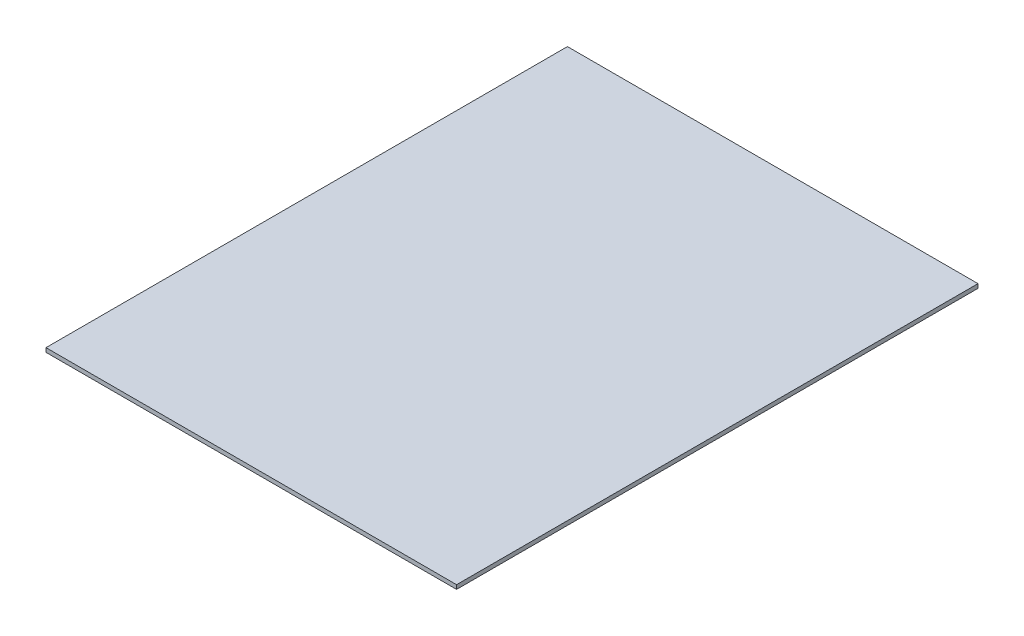
ISO-10303-21;
HEADER;
FILE_DESCRIPTION(('STEP AP214'),'2;1');
FILE_NAME('part.step','',(''),(''),'','','');
FILE_SCHEMA(('AUTOMOTIVE_DESIGN { 1 0 10303 214 1 1 1 1 }'));
ENDSEC;
DATA;
#1=APPLICATION_CONTEXT('core data for automotive mechanical design processes');
#2=APPLICATION_PROTOCOL_DEFINITION('international standard','automotive_design',2000,#1);
#3=PRODUCT_CONTEXT('',#1,'mechanical');
#4=PRODUCT('Part','Part','',(#3));
#5=PRODUCT_RELATED_PRODUCT_CATEGORY('part','',(#4));
#6=PRODUCT_DEFINITION_FORMATION('','',#4);
#7=PRODUCT_DEFINITION_CONTEXT('part definition',#1,'design');
#8=PRODUCT_DEFINITION('design','',#6,#7);
#9=PRODUCT_DEFINITION_SHAPE('','',#8);
#10=(LENGTH_UNIT() NAMED_UNIT(*) SI_UNIT(.MILLI.,.METRE.));
#11=(NAMED_UNIT(*) PLANE_ANGLE_UNIT() SI_UNIT($,.RADIAN.));
#12=(NAMED_UNIT(*) SI_UNIT($,.STERADIAN.) SOLID_ANGLE_UNIT());
#13=UNCERTAINTY_MEASURE_WITH_UNIT(LENGTH_MEASURE(1.E-05),#10,'distance_accuracy_value','');
#14=(GEOMETRIC_REPRESENTATION_CONTEXT(3) GLOBAL_UNCERTAINTY_ASSIGNED_CONTEXT((#13)) GLOBAL_UNIT_ASSIGNED_CONTEXT((#10,
#11,#12)) REPRESENTATION_CONTEXT('',''));
#15=CARTESIAN_POINT('',(0.,0.,0.));
#16=DIRECTION('',(0.,0.,1.));
#17=DIRECTION('',(1.,0.,0.));
#18=AXIS2_PLACEMENT_3D('',#15,#16,#17);
#19=CARTESIAN_POINT('',(-150.,3.,190.5));
#20=DIRECTION('',(1.,0.,0.));
#21=DIRECTION('',(0.,0.,-1.));
#22=AXIS2_PLACEMENT_3D('',#19,#20,#21);
#23=PLANE('',#22);
#24=DIRECTION('',(0.,0.,1.));
#25=VECTOR('',#24,1.);
#26=CARTESIAN_POINT('',(-150.,0.,190.5));
#27=LINE('',#26,#25);
#28=CARTESIAN_POINT('',(-150.,0.,-190.5));
#29=VERTEX_POINT('',#28);
#30=CARTESIAN_POINT('',(-150.,0.,190.5));
#31=VERTEX_POINT('',#30);
#32=EDGE_CURVE('E95',#29,#31,#27,.T.);
#33=ORIENTED_EDGE('',*,*,#32,.T.);
#34=DIRECTION('',(0.,-1.,0.));
#35=VECTOR('',#34,1.);
#36=CARTESIAN_POINT('',(-150.,3.,190.5));
#37=LINE('',#36,#35);
#38=CARTESIAN_POINT('',(-150.,3.,190.5));
#39=VERTEX_POINT('',#38);
#40=EDGE_CURVE('E11',#39,#31,#37,.T.);
#41=ORIENTED_EDGE('',*,*,#40,.F.);
#42=DIRECTION('',(0.,0.,1.));
#43=VECTOR('',#42,1.);
#44=CARTESIAN_POINT('',(-150.,3.,190.5));
#45=LINE('',#44,#43);
#46=CARTESIAN_POINT('',(-150.,3.,-190.5));
#47=VERTEX_POINT('',#46);
#48=EDGE_CURVE('E83',#47,#39,#45,.T.);
#49=ORIENTED_EDGE('',*,*,#48,.F.);
#50=DIRECTION('',(0.,-1.,0.));
#51=VECTOR('',#50,1.);
#52=CARTESIAN_POINT('',(-150.,3.,-190.5));
#53=LINE('',#52,#51);
#54=EDGE_CURVE('E91',#47,#29,#53,.T.);
#55=ORIENTED_EDGE('',*,*,#54,.T.);
#56=EDGE_LOOP('',(#33,#41,#49,#55));
#57=FACE_BOUND('',#56,.T.);
#58=ADVANCED_FACE('F32',(#57),#23,.F.);
#59=CARTESIAN_POINT('',(-150.,3.,190.5));
#60=DIRECTION('',(0.,0.,-1.));
#61=DIRECTION('',(-1.,0.,0.));
#62=AXIS2_PLACEMENT_3D('',#59,#60,#61);
#63=PLANE('',#62);
#64=DIRECTION('',(1.,0.,0.));
#65=VECTOR('',#64,1.);
#66=CARTESIAN_POINT('',(-150.,0.,190.5));
#67=LINE('',#66,#65);
#68=CARTESIAN_POINT('',(150.,0.,190.5));
#69=VERTEX_POINT('',#68);
#70=EDGE_CURVE('E87',#31,#69,#67,.T.);
#71=ORIENTED_EDGE('',*,*,#70,.T.);
#72=DIRECTION('',(0.,-1.,0.));
#73=VECTOR('',#72,1.);
#74=CARTESIAN_POINT('',(150.,3.,190.5));
#75=LINE('',#74,#73);
#76=CARTESIAN_POINT('',(150.,3.,190.5));
#77=VERTEX_POINT('',#76);
#78=EDGE_CURVE('E40',#77,#69,#75,.T.);
#79=ORIENTED_EDGE('',*,*,#78,.F.);
#80=DIRECTION('',(1.,0.,0.));
#81=VECTOR('',#80,1.);
#82=CARTESIAN_POINT('',(-150.,3.,190.5));
#83=LINE('',#82,#81);
#84=EDGE_CURVE('E78',#39,#77,#83,.T.);
#85=ORIENTED_EDGE('',*,*,#84,.F.);
#86=ORIENTED_EDGE('',*,*,#40,.T.);
#87=EDGE_LOOP('',(#71,#79,#85,#86));
#88=FACE_BOUND('',#87,.T.);
#89=ADVANCED_FACE('F86',(#88),#63,.F.);
#90=CARTESIAN_POINT('',(150.,3.,190.5));
#91=DIRECTION('',(-1.,0.,0.));
#92=DIRECTION('',(0.,0.,1.));
#93=AXIS2_PLACEMENT_3D('',#90,#91,#92);
#94=PLANE('',#93);
#95=DIRECTION('',(0.,0.,-1.));
#96=VECTOR('',#95,1.);
#97=CARTESIAN_POINT('',(150.,0.,190.5));
#98=LINE('',#97,#96);
#99=CARTESIAN_POINT('',(150.,0.,-190.5));
#100=VERTEX_POINT('',#99);
#101=EDGE_CURVE('E65',#69,#100,#98,.T.);
#102=ORIENTED_EDGE('',*,*,#101,.T.);
#103=DIRECTION('',(0.,-1.,0.));
#104=VECTOR('',#103,1.);
#105=CARTESIAN_POINT('',(150.,3.,-190.5));
#106=LINE('',#105,#104);
#107=CARTESIAN_POINT('',(150.,3.,-190.5));
#108=VERTEX_POINT('',#107);
#109=EDGE_CURVE('E88',#108,#100,#106,.T.);
#110=ORIENTED_EDGE('',*,*,#109,.F.);
#111=DIRECTION('',(0.,0.,-1.));
#112=VECTOR('',#111,1.);
#113=CARTESIAN_POINT('',(150.,3.,190.5));
#114=LINE('',#113,#112);
#115=EDGE_CURVE('E81',#77,#108,#114,.T.);
#116=ORIENTED_EDGE('',*,*,#115,.F.);
#117=ORIENTED_EDGE('',*,*,#78,.T.);
#118=EDGE_LOOP('',(#102,#110,#116,#117));
#119=FACE_BOUND('',#118,.T.);
#120=ADVANCED_FACE('F89',(#119),#94,.F.);
#121=CARTESIAN_POINT('',(-150.,3.,-190.5));
#122=DIRECTION('',(0.,0.,1.));
#123=DIRECTION('',(1.,0.,0.));
#124=AXIS2_PLACEMENT_3D('',#121,#122,#123);
#125=PLANE('',#124);
#126=DIRECTION('',(-1.,0.,0.));
#127=VECTOR('',#126,1.);
#128=CARTESIAN_POINT('',(-150.,0.,-190.5));
#129=LINE('',#128,#127);
#130=EDGE_CURVE('E71',#100,#29,#129,.T.);
#131=ORIENTED_EDGE('',*,*,#130,.T.);
#132=ORIENTED_EDGE('',*,*,#54,.F.);
#133=DIRECTION('',(-1.,0.,0.));
#134=VECTOR('',#133,1.);
#135=CARTESIAN_POINT('',(-150.,3.,-190.5));
#136=LINE('',#135,#134);
#137=EDGE_CURVE('E48',#108,#47,#136,.T.);
#138=ORIENTED_EDGE('',*,*,#137,.F.);
#139=ORIENTED_EDGE('',*,*,#109,.T.);
#140=EDGE_LOOP('',(#131,#132,#138,#139));
#141=FACE_BOUND('',#140,.T.);
#142=ADVANCED_FACE('F102',(#141),#125,.F.);
#143=CARTESIAN_POINT('',(-150.,3.,-190.5));
#144=DIRECTION('',(0.,-1.,0.));
#145=DIRECTION('',(0.,0.,-1.));
#146=AXIS2_PLACEMENT_3D('',#143,#144,#145);
#147=PLANE('',#146);
#148=ORIENTED_EDGE('',*,*,#48,.T.);
#149=ORIENTED_EDGE('',*,*,#84,.T.);
#150=ORIENTED_EDGE('',*,*,#115,.T.);
#151=ORIENTED_EDGE('',*,*,#137,.T.);
#152=EDGE_LOOP('',(#148,#149,#150,#151));
#153=FACE_BOUND('',#152,.T.);
#154=ADVANCED_FACE('F79',(#153),#147,.F.);
#155=CARTESIAN_POINT('',(-150.,0.,-190.5));
#156=DIRECTION('',(0.,-1.,0.));
#157=DIRECTION('',(0.,0.,-1.));
#158=AXIS2_PLACEMENT_3D('',#155,#156,#157);
#159=PLANE('',#158);
#160=ORIENTED_EDGE('',*,*,#32,.F.);
#161=ORIENTED_EDGE('',*,*,#130,.F.);
#162=ORIENTED_EDGE('',*,*,#101,.F.);
#163=ORIENTED_EDGE('',*,*,#70,.F.);
#164=EDGE_LOOP('',(#160,#161,#162,#163));
#165=FACE_BOUND('',#164,.T.);
#166=ADVANCED_FACE('F105',(#165),#159,.T.);
#167=CLOSED_SHELL('',(#58,#89,#120,#142,#154,#166));
#168=MANIFOLD_SOLID_BREP('B2',#167);
#169=ADVANCED_BREP_SHAPE_REPRESENTATION('',(#18,#168),#14);
#170=SHAPE_DEFINITION_REPRESENTATION(#9,#169);
ENDSEC;
END-ISO-10303-21;
